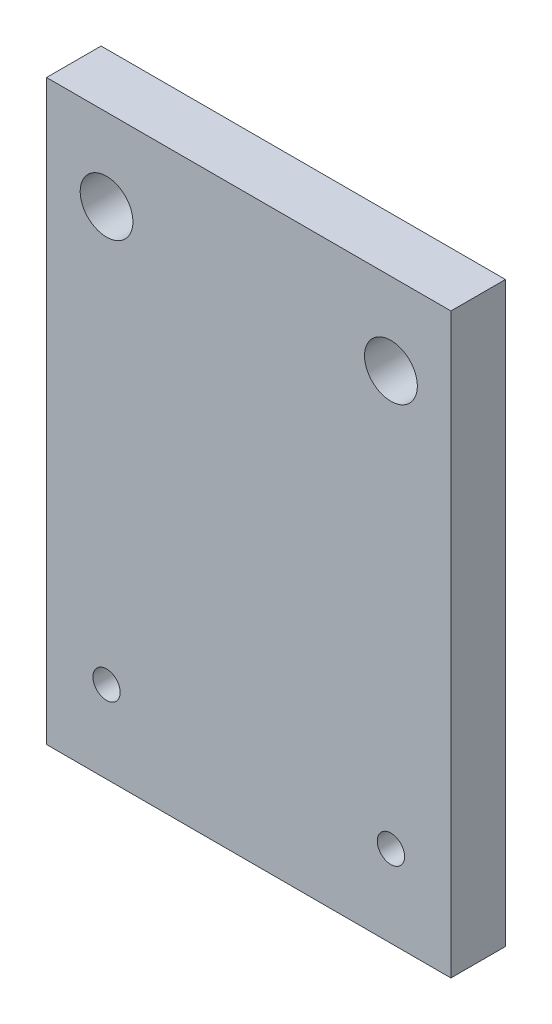
ISO-10303-21;
HEADER;
FILE_DESCRIPTION(('STEP AP214'),'2;1');
FILE_NAME('part.step','',(''),(''),'','','');
FILE_SCHEMA(('AUTOMOTIVE_DESIGN { 1 0 10303 214 1 1 1 1 }'));
ENDSEC;
DATA;
#1=APPLICATION_CONTEXT('core data for automotive mechanical design processes');
#2=APPLICATION_PROTOCOL_DEFINITION('international standard','automotive_design',2000,#1);
#3=PRODUCT_CONTEXT('',#1,'mechanical');
#4=PRODUCT('Part','Part','',(#3));
#5=PRODUCT_RELATED_PRODUCT_CATEGORY('part','',(#4));
#6=PRODUCT_DEFINITION_FORMATION('','',#4);
#7=PRODUCT_DEFINITION_CONTEXT('part definition',#1,'design');
#8=PRODUCT_DEFINITION('design','',#6,#7);
#9=PRODUCT_DEFINITION_SHAPE('','',#8);
#10=(LENGTH_UNIT() NAMED_UNIT(*) SI_UNIT(.MILLI.,.METRE.));
#11=(NAMED_UNIT(*) PLANE_ANGLE_UNIT() SI_UNIT($,.RADIAN.));
#12=(NAMED_UNIT(*) SI_UNIT($,.STERADIAN.) SOLID_ANGLE_UNIT());
#13=UNCERTAINTY_MEASURE_WITH_UNIT(LENGTH_MEASURE(1.E-05),#10,'distance_accuracy_value','');
#14=(GEOMETRIC_REPRESENTATION_CONTEXT(3) GLOBAL_UNCERTAINTY_ASSIGNED_CONTEXT((#13)) GLOBAL_UNIT_ASSIGNED_CONTEXT((#10,
#11,#12)) REPRESENTATION_CONTEXT('',''));
#15=CARTESIAN_POINT('',(0.,0.,0.));
#16=DIRECTION('',(0.,0.,1.));
#17=DIRECTION('',(1.,0.,0.));
#18=AXIS2_PLACEMENT_3D('',#15,#16,#17);
#19=CARTESIAN_POINT('',(0.,0.,5.9944));
#20=DIRECTION('',(0.,0.,1.));
#21=DIRECTION('',(1.,0.,0.));
#22=AXIS2_PLACEMENT_3D('',#19,#20,#21);
#23=PLANE('',#22);
#24=CARTESIAN_POINT('',(37.854999982,-54.499999966,5.9944));
#25=DIRECTION('',(0.,0.,1.));
#26=DIRECTION('',(1.,0.,0.));
#27=AXIS2_PLACEMENT_3D('',#24,#25,#26);
#28=CIRCLE('',#27,1.5);
#29=CARTESIAN_POINT('',(36.354999982,-54.499999966,5.9944));
#30=VERTEX_POINT('',#29);
#31=EDGE_CURVE('E146',#30,#30,#28,.T.);
#32=ORIENTED_EDGE('',*,*,#31,.F.);
#33=EDGE_LOOP('',(#32));
#34=FACE_BOUND('',#33,.T.);
#35=CARTESIAN_POINT('',(6.595000018,-9.000000034,5.9944));
#36=DIRECTION('',(0.,0.,1.));
#37=DIRECTION('',(1.,0.,0.));
#38=AXIS2_PLACEMENT_3D('',#35,#36,#37);
#39=CIRCLE('',#38,2.900000042);
#40=CARTESIAN_POINT('',(3.694999976,-9.000000034,5.9944));
#41=VERTEX_POINT('',#40);
#42=EDGE_CURVE('E116',#41,#41,#39,.T.);
#43=ORIENTED_EDGE('',*,*,#42,.F.);
#44=EDGE_LOOP('',(#43));
#45=FACE_BOUND('',#44,.T.);
#46=DIRECTION('',(0.,-1.,0.));
#47=VECTOR('',#46,1.);
#48=CARTESIAN_POINT('',(0.,0.,5.9944));
#49=LINE('',#48,#47);
#50=CARTESIAN_POINT('',(0.,0.,5.9944));
#51=VERTEX_POINT('',#50);
#52=CARTESIAN_POINT('',(0.,-63.5,5.9944));
#53=VERTEX_POINT('',#52);
#54=EDGE_CURVE('E96',#51,#53,#49,.T.);
#55=ORIENTED_EDGE('',*,*,#54,.T.);
#56=DIRECTION('',(1.,0.,0.));
#57=VECTOR('',#56,1.);
#58=CARTESIAN_POINT('',(0.,-63.5,5.9944));
#59=LINE('',#58,#57);
#60=CARTESIAN_POINT('',(44.45,-63.5,5.9944));
#61=VERTEX_POINT('',#60);
#62=EDGE_CURVE('E91',#53,#61,#59,.T.);
#63=ORIENTED_EDGE('',*,*,#62,.T.);
#64=DIRECTION('',(0.,1.,0.));
#65=VECTOR('',#64,1.);
#66=CARTESIAN_POINT('',(44.45,0.,5.9944));
#67=LINE('',#66,#65);
#68=CARTESIAN_POINT('',(44.45,0.,5.9944));
#69=VERTEX_POINT('',#68);
#70=EDGE_CURVE('E94',#61,#69,#67,.T.);
#71=ORIENTED_EDGE('',*,*,#70,.T.);
#72=DIRECTION('',(-1.,0.,0.));
#73=VECTOR('',#72,1.);
#74=CARTESIAN_POINT('',(0.,0.,5.9944));
#75=LINE('',#74,#73);
#76=EDGE_CURVE('E61',#69,#51,#75,.T.);
#77=ORIENTED_EDGE('',*,*,#76,.T.);
#78=EDGE_LOOP('',(#55,#63,#71,#77));
#79=FACE_BOUND('',#78,.T.);
#80=CARTESIAN_POINT('',(37.854999982,-9.000000034,5.9944));
#81=DIRECTION('',(0.,0.,1.));
#82=DIRECTION('',(1.,0.,0.));
#83=AXIS2_PLACEMENT_3D('',#80,#81,#82);
#84=CIRCLE('',#83,2.900000042);
#85=CARTESIAN_POINT('',(34.95499994,-9.000000034,5.9944));
#86=VERTEX_POINT('',#85);
#87=EDGE_CURVE('E138',#86,#86,#84,.T.);
#88=ORIENTED_EDGE('',*,*,#87,.F.);
#89=EDGE_LOOP('',(#88));
#90=FACE_BOUND('',#89,.T.);
#91=CARTESIAN_POINT('',(6.595000018,-54.499999966,5.9944));
#92=DIRECTION('',(0.,0.,1.));
#93=DIRECTION('',(1.,0.,0.));
#94=AXIS2_PLACEMENT_3D('',#91,#92,#93);
#95=CIRCLE('',#94,1.5);
#96=CARTESIAN_POINT('',(5.095000018,-54.499999966,5.9944));
#97=VERTEX_POINT('',#96);
#98=EDGE_CURVE('E154',#97,#97,#95,.T.);
#99=ORIENTED_EDGE('',*,*,#98,.F.);
#100=EDGE_LOOP('',(#99));
#101=FACE_BOUND('',#100,.T.);
#102=ADVANCED_FACE('F43',(#34,#45,#79,#90,#101),#23,.T.);
#103=CARTESIAN_POINT('',(0.,0.,0.));
#104=DIRECTION('',(0.,0.,1.));
#105=DIRECTION('',(1.,0.,0.));
#106=AXIS2_PLACEMENT_3D('',#103,#104,#105);
#107=PLANE('',#106);
#108=DIRECTION('',(0.,-1.,0.));
#109=VECTOR('',#108,1.);
#110=CARTESIAN_POINT('',(0.,0.,0.));
#111=LINE('',#110,#109);
#112=CARTESIAN_POINT('',(0.,0.,0.));
#113=VERTEX_POINT('',#112);
#114=CARTESIAN_POINT('',(0.,-63.5,0.));
#115=VERTEX_POINT('',#114);
#116=EDGE_CURVE('E112',#113,#115,#111,.T.);
#117=ORIENTED_EDGE('',*,*,#116,.F.);
#118=DIRECTION('',(-1.,0.,0.));
#119=VECTOR('',#118,1.);
#120=CARTESIAN_POINT('',(0.,0.,0.));
#121=LINE('',#120,#119);
#122=CARTESIAN_POINT('',(44.45,0.,0.));
#123=VERTEX_POINT('',#122);
#124=EDGE_CURVE('E84',#123,#113,#121,.T.);
#125=ORIENTED_EDGE('',*,*,#124,.F.);
#126=DIRECTION('',(0.,1.,0.));
#127=VECTOR('',#126,1.);
#128=CARTESIAN_POINT('',(44.45,0.,0.));
#129=LINE('',#128,#127);
#130=CARTESIAN_POINT('',(44.45,-63.5,0.));
#131=VERTEX_POINT('',#130);
#132=EDGE_CURVE('E78',#131,#123,#129,.T.);
#133=ORIENTED_EDGE('',*,*,#132,.F.);
#134=DIRECTION('',(1.,0.,0.));
#135=VECTOR('',#134,1.);
#136=CARTESIAN_POINT('',(0.,-63.5,0.));
#137=LINE('',#136,#135);
#138=EDGE_CURVE('E101',#115,#131,#137,.T.);
#139=ORIENTED_EDGE('',*,*,#138,.F.);
#140=EDGE_LOOP('',(#117,#125,#133,#139));
#141=FACE_BOUND('',#140,.T.);
#142=CARTESIAN_POINT('',(6.595000018,-9.000000034,0.));
#143=DIRECTION('',(0.,0.,1.));
#144=DIRECTION('',(1.,0.,0.));
#145=AXIS2_PLACEMENT_3D('',#142,#143,#144);
#146=CIRCLE('',#145,2.900000042);
#147=CARTESIAN_POINT('',(3.694999976,-9.000000034,0.));
#148=VERTEX_POINT('',#147);
#149=EDGE_CURVE('E134',#148,#148,#146,.T.);
#150=ORIENTED_EDGE('',*,*,#149,.T.);
#151=EDGE_LOOP('',(#150));
#152=FACE_BOUND('',#151,.T.);
#153=CARTESIAN_POINT('',(37.854999982,-9.000000034,0.));
#154=DIRECTION('',(0.,0.,1.));
#155=DIRECTION('',(1.,0.,0.));
#156=AXIS2_PLACEMENT_3D('',#153,#154,#155);
#157=CIRCLE('',#156,2.900000042);
#158=CARTESIAN_POINT('',(34.95499994,-9.000000034,0.));
#159=VERTEX_POINT('',#158);
#160=EDGE_CURVE('E142',#159,#159,#157,.T.);
#161=ORIENTED_EDGE('',*,*,#160,.T.);
#162=EDGE_LOOP('',(#161));
#163=FACE_BOUND('',#162,.T.);
#164=CARTESIAN_POINT('',(37.854999982,-54.499999966,0.));
#165=DIRECTION('',(0.,0.,1.));
#166=DIRECTION('',(1.,0.,0.));
#167=AXIS2_PLACEMENT_3D('',#164,#165,#166);
#168=CIRCLE('',#167,1.5);
#169=CARTESIAN_POINT('',(36.354999982,-54.499999966,0.));
#170=VERTEX_POINT('',#169);
#171=EDGE_CURVE('E150',#170,#170,#168,.T.);
#172=ORIENTED_EDGE('',*,*,#171,.T.);
#173=EDGE_LOOP('',(#172));
#174=FACE_BOUND('',#173,.T.);
#175=CARTESIAN_POINT('',(6.595000018,-54.499999966,0.));
#176=DIRECTION('',(0.,0.,1.));
#177=DIRECTION('',(1.,0.,0.));
#178=AXIS2_PLACEMENT_3D('',#175,#176,#177);
#179=CIRCLE('',#178,1.5);
#180=CARTESIAN_POINT('',(5.095000018,-54.499999966,0.));
#181=VERTEX_POINT('',#180);
#182=EDGE_CURVE('E158',#181,#181,#179,.T.);
#183=ORIENTED_EDGE('',*,*,#182,.T.);
#184=EDGE_LOOP('',(#183));
#185=FACE_BOUND('',#184,.T.);
#186=ADVANCED_FACE('F129',(#141,#152,#163,#174,#185),#107,.F.);
#187=CARTESIAN_POINT('',(0.,0.,5.9944));
#188=DIRECTION('',(1.,0.,0.));
#189=DIRECTION('',(0.,1.,0.));
#190=AXIS2_PLACEMENT_3D('',#187,#188,#189);
#191=PLANE('',#190);
#192=ORIENTED_EDGE('',*,*,#116,.T.);
#193=DIRECTION('',(0.,0.,-1.));
#194=VECTOR('',#193,1.);
#195=CARTESIAN_POINT('',(0.,-63.5,5.9944));
#196=LINE('',#195,#194);
#197=EDGE_CURVE('E11',#53,#115,#196,.T.);
#198=ORIENTED_EDGE('',*,*,#197,.F.);
#199=ORIENTED_EDGE('',*,*,#54,.F.);
#200=DIRECTION('',(0.,0.,-1.));
#201=VECTOR('',#200,1.);
#202=CARTESIAN_POINT('',(0.,0.,5.9944));
#203=LINE('',#202,#201);
#204=EDGE_CURVE('E108',#51,#113,#203,.T.);
#205=ORIENTED_EDGE('',*,*,#204,.T.);
#206=EDGE_LOOP('',(#192,#198,#199,#205));
#207=FACE_BOUND('',#206,.T.);
#208=ADVANCED_FACE('F45',(#207),#191,.F.);
#209=CARTESIAN_POINT('',(0.,-63.5,5.9944));
#210=DIRECTION('',(0.,1.,0.));
#211=DIRECTION('',(0.,0.,1.));
#212=AXIS2_PLACEMENT_3D('',#209,#210,#211);
#213=PLANE('',#212);
#214=ORIENTED_EDGE('',*,*,#138,.T.);
#215=DIRECTION('',(0.,0.,-1.));
#216=VECTOR('',#215,1.);
#217=CARTESIAN_POINT('',(44.45,-63.5,5.9944));
#218=LINE('',#217,#216);
#219=EDGE_CURVE('E53',#61,#131,#218,.T.);
#220=ORIENTED_EDGE('',*,*,#219,.F.);
#221=ORIENTED_EDGE('',*,*,#62,.F.);
#222=ORIENTED_EDGE('',*,*,#197,.T.);
#223=EDGE_LOOP('',(#214,#220,#221,#222));
#224=FACE_BOUND('',#223,.T.);
#225=ADVANCED_FACE('F100',(#224),#213,.F.);
#226=CARTESIAN_POINT('',(44.45,0.,5.9944));
#227=DIRECTION('',(-1.,0.,0.));
#228=DIRECTION('',(0.,-1.,0.));
#229=AXIS2_PLACEMENT_3D('',#226,#227,#228);
#230=PLANE('',#229);
#231=ORIENTED_EDGE('',*,*,#132,.T.);
#232=DIRECTION('',(0.,0.,-1.));
#233=VECTOR('',#232,1.);
#234=CARTESIAN_POINT('',(44.45,0.,5.9944));
#235=LINE('',#234,#233);
#236=EDGE_CURVE('E103',#69,#123,#235,.T.);
#237=ORIENTED_EDGE('',*,*,#236,.F.);
#238=ORIENTED_EDGE('',*,*,#70,.F.);
#239=ORIENTED_EDGE('',*,*,#219,.T.);
#240=EDGE_LOOP('',(#231,#237,#238,#239));
#241=FACE_BOUND('',#240,.T.);
#242=ADVANCED_FACE('F104',(#241),#230,.F.);
#243=CARTESIAN_POINT('',(0.,0.,5.9944));
#244=DIRECTION('',(0.,-1.,0.));
#245=DIRECTION('',(0.,0.,-1.));
#246=AXIS2_PLACEMENT_3D('',#243,#244,#245);
#247=PLANE('',#246);
#248=ORIENTED_EDGE('',*,*,#124,.T.);
#249=ORIENTED_EDGE('',*,*,#204,.F.);
#250=ORIENTED_EDGE('',*,*,#76,.F.);
#251=ORIENTED_EDGE('',*,*,#236,.T.);
#252=EDGE_LOOP('',(#248,#249,#250,#251));
#253=FACE_BOUND('',#252,.T.);
#254=ADVANCED_FACE('F126',(#253),#247,.F.);
#255=CARTESIAN_POINT('',(6.595000018,-9.000000034,5.9944));
#256=DIRECTION('',(0.,0.,-1.));
#257=DIRECTION('',(-1.,0.,0.));
#258=AXIS2_PLACEMENT_3D('',#255,#256,#257);
#259=CYLINDRICAL_SURFACE('',#258,2.900000042);
#260=CARTESIAN_POINT('',(3.694999976,-9.000000034,5.9944));
#261=CARTESIAN_POINT('',(3.694999976,-9.000000034,5.93195833333333));
#262=CARTESIAN_POINT('',(3.694999976,-9.000000034,5.86951666666667));
#263=CARTESIAN_POINT('',(3.694999976,-9.000000034,5.74463333333333));
#264=CARTESIAN_POINT('',(3.694999976,-9.000000034,5.68219166666667));
#265=CARTESIAN_POINT('',(3.694999976,-9.000000034,5.55730833333333));
#266=CARTESIAN_POINT('',(3.694999976,-9.000000034,5.49486666666667));
#267=CARTESIAN_POINT('',(3.694999976,-9.000000034,5.36998333333333));
#268=CARTESIAN_POINT('',(3.694999976,-9.000000034,5.30754166666667));
#269=CARTESIAN_POINT('',(3.694999976,-9.000000034,5.18265833333333));
#270=CARTESIAN_POINT('',(3.694999976,-9.000000034,5.12021666666667));
#271=CARTESIAN_POINT('',(3.694999976,-9.000000034,4.99533333333333));
#272=CARTESIAN_POINT('',(3.694999976,-9.000000034,4.93289166666667));
#273=CARTESIAN_POINT('',(3.694999976,-9.000000034,4.80800833333333));
#274=CARTESIAN_POINT('',(3.694999976,-9.000000034,4.74556666666667));
#275=CARTESIAN_POINT('',(3.694999976,-9.000000034,4.62068333333333));
#276=CARTESIAN_POINT('',(3.694999976,-9.000000034,4.55824166666667));
#277=CARTESIAN_POINT('',(3.694999976,-9.000000034,4.43335833333333));
#278=CARTESIAN_POINT('',(3.694999976,-9.000000034,4.37091666666667));
#279=CARTESIAN_POINT('',(3.694999976,-9.000000034,4.24603333333333));
#280=CARTESIAN_POINT('',(3.694999976,-9.000000034,4.18359166666667));
#281=CARTESIAN_POINT('',(3.694999976,-9.000000034,4.05870833333333));
#282=CARTESIAN_POINT('',(3.694999976,-9.000000034,3.99626666666667));
#283=CARTESIAN_POINT('',(3.694999976,-9.000000034,3.87138333333333));
#284=CARTESIAN_POINT('',(3.694999976,-9.000000034,3.80894166666667));
#285=CARTESIAN_POINT('',(3.694999976,-9.000000034,3.68405833333333));
#286=CARTESIAN_POINT('',(3.694999976,-9.000000034,3.62161666666667));
#287=CARTESIAN_POINT('',(3.694999976,-9.000000034,3.49673333333333));
#288=CARTESIAN_POINT('',(3.694999976,-9.000000034,3.43429166666667));
#289=CARTESIAN_POINT('',(3.694999976,-9.000000034,3.30940833333333));
#290=CARTESIAN_POINT('',(3.694999976,-9.000000034,3.24696666666667));
#291=CARTESIAN_POINT('',(3.694999976,-9.000000034,3.12208333333333));
#292=CARTESIAN_POINT('',(3.694999976,-9.000000034,3.05964166666667));
#293=CARTESIAN_POINT('',(3.694999976,-9.000000034,2.93475833333333));
#294=CARTESIAN_POINT('',(3.694999976,-9.000000034,2.87231666666667));
#295=CARTESIAN_POINT('',(3.694999976,-9.000000034,2.74743333333333));
#296=CARTESIAN_POINT('',(3.694999976,-9.000000034,2.68499166666667));
#297=CARTESIAN_POINT('',(3.694999976,-9.000000034,2.56010833333333));
#298=CARTESIAN_POINT('',(3.694999976,-9.000000034,2.49766666666667));
#299=CARTESIAN_POINT('',(3.694999976,-9.000000034,2.37278333333333));
#300=CARTESIAN_POINT('',(3.694999976,-9.000000034,2.31034166666667));
#301=CARTESIAN_POINT('',(3.694999976,-9.000000034,2.18545833333333));
#302=CARTESIAN_POINT('',(3.694999976,-9.000000034,2.12301666666667));
#303=CARTESIAN_POINT('',(3.694999976,-9.000000034,1.99813333333333));
#304=CARTESIAN_POINT('',(3.694999976,-9.000000034,1.93569166666667));
#305=CARTESIAN_POINT('',(3.694999976,-9.000000034,1.81080833333333));
#306=CARTESIAN_POINT('',(3.694999976,-9.000000034,1.74836666666667));
#307=CARTESIAN_POINT('',(3.694999976,-9.000000034,1.62348333333333));
#308=CARTESIAN_POINT('',(3.694999976,-9.000000034,1.56104166666667));
#309=CARTESIAN_POINT('',(3.694999976,-9.000000034,1.43615833333333));
#310=CARTESIAN_POINT('',(3.694999976,-9.000000034,1.37371666666667));
#311=CARTESIAN_POINT('',(3.694999976,-9.000000034,1.24883333333333));
#312=CARTESIAN_POINT('',(3.694999976,-9.000000034,1.18639166666667));
#313=CARTESIAN_POINT('',(3.694999976,-9.000000034,1.06150833333333));
#314=CARTESIAN_POINT('',(3.694999976,-9.000000034,0.999066666666667));
#315=CARTESIAN_POINT('',(3.694999976,-9.000000034,0.874183333333333));
#316=CARTESIAN_POINT('',(3.694999976,-9.000000034,0.811741666666666));
#317=CARTESIAN_POINT('',(3.694999976,-9.000000034,0.686858333333333));
#318=CARTESIAN_POINT('',(3.694999976,-9.000000034,0.624416666666667));
#319=CARTESIAN_POINT('',(3.694999976,-9.000000034,0.499533333333333));
#320=CARTESIAN_POINT('',(3.694999976,-9.000000034,0.437091666666667));
#321=CARTESIAN_POINT('',(3.694999976,-9.000000034,0.312208333333333));
#322=CARTESIAN_POINT('',(3.694999976,-9.000000034,0.249766666666667));
#323=CARTESIAN_POINT('',(3.694999976,-9.000000034,0.124883333333334));
#324=CARTESIAN_POINT('',(3.694999976,-9.000000034,0.0624416666666667));
#325=CARTESIAN_POINT('',(3.694999976,-9.000000034,0.));
#326=B_SPLINE_CURVE_WITH_KNOTS('',3,(#260,#261,#262,#263,#264,#265,#266,#267,#268,#269,#270,
#271,#272,#273,#274,#275,#276,#277,#278,#279,#280,#281,#282,#283,#284,#285,#286,#287,#288,#289,
#290,#291,#292,#293,#294,#295,#296,#297,#298,#299,#300,#301,#302,#303,#304,#305,#306,#307,#308,
#309,#310,#311,#312,#313,#314,#315,#316,#317,#318,#319,#320,#321,#322,#323,#324,#325),
.UNSPECIFIED.,.F.,.F.,(4,2,2,2,2,2,2,2,2,2,2,2,2,2,2,2,2,2,2,2,2,2,2,2,2,2,2,2,2,2,2,2,4),(0.,
0.187324999999999,0.37465,0.561974999999999,0.7493,0.936624999999999,1.12395,1.311275,1.4986,
1.685925,1.87325,2.060575,2.2479,2.435225,2.62255,2.809875,2.9972,3.184525,3.37185,3.559175,
3.7465,3.933825,4.12115,4.308475,4.4958,4.683125,4.87045,5.057775,5.2451,5.432425,5.61975,
5.807075,5.9944),.UNSPECIFIED.);
#327=EDGE_CURVE('BSEAM179',#41,#148,#326,.T.);
#328=ORIENTED_EDGE('',*,*,#42,.T.);
#329=ORIENTED_EDGE('',*,*,#149,.F.);
#330=ORIENTED_EDGE('',*,*,#327,.T.);
#331=ORIENTED_EDGE('',*,*,#327,.F.);
#332=EDGE_LOOP('',(#328,#330,#329,#331));
#333=FACE_BOUND('',#332,.T.);
#334=ADVANCED_FACE('F179',(#333),#259,.F.);
#335=CARTESIAN_POINT('',(37.854999982,-9.000000034,5.9944));
#336=DIRECTION('',(0.,0.,-1.));
#337=DIRECTION('',(-1.,0.,0.));
#338=AXIS2_PLACEMENT_3D('',#335,#336,#337);
#339=CYLINDRICAL_SURFACE('',#338,2.900000042);
#340=CARTESIAN_POINT('',(34.95499994,-9.000000034,5.9944));
#341=CARTESIAN_POINT('',(34.95499994,-9.000000034,5.93195833333333));
#342=CARTESIAN_POINT('',(34.95499994,-9.000000034,5.86951666666667));
#343=CARTESIAN_POINT('',(34.95499994,-9.000000034,5.74463333333333));
#344=CARTESIAN_POINT('',(34.95499994,-9.000000034,5.68219166666667));
#345=CARTESIAN_POINT('',(34.95499994,-9.000000034,5.55730833333333));
#346=CARTESIAN_POINT('',(34.95499994,-9.000000034,5.49486666666667));
#347=CARTESIAN_POINT('',(34.95499994,-9.000000034,5.36998333333333));
#348=CARTESIAN_POINT('',(34.95499994,-9.000000034,5.30754166666667));
#349=CARTESIAN_POINT('',(34.95499994,-9.000000034,5.18265833333333));
#350=CARTESIAN_POINT('',(34.95499994,-9.000000034,5.12021666666667));
#351=CARTESIAN_POINT('',(34.95499994,-9.000000034,4.99533333333333));
#352=CARTESIAN_POINT('',(34.95499994,-9.000000034,4.93289166666667));
#353=CARTESIAN_POINT('',(34.95499994,-9.000000034,4.80800833333333));
#354=CARTESIAN_POINT('',(34.95499994,-9.000000034,4.74556666666667));
#355=CARTESIAN_POINT('',(34.95499994,-9.000000034,4.62068333333333));
#356=CARTESIAN_POINT('',(34.95499994,-9.000000034,4.55824166666667));
#357=CARTESIAN_POINT('',(34.95499994,-9.000000034,4.43335833333333));
#358=CARTESIAN_POINT('',(34.95499994,-9.000000034,4.37091666666667));
#359=CARTESIAN_POINT('',(34.95499994,-9.000000034,4.24603333333333));
#360=CARTESIAN_POINT('',(34.95499994,-9.000000034,4.18359166666667));
#361=CARTESIAN_POINT('',(34.95499994,-9.000000034,4.05870833333333));
#362=CARTESIAN_POINT('',(34.95499994,-9.000000034,3.99626666666667));
#363=CARTESIAN_POINT('',(34.95499994,-9.000000034,3.87138333333333));
#364=CARTESIAN_POINT('',(34.95499994,-9.000000034,3.80894166666667));
#365=CARTESIAN_POINT('',(34.95499994,-9.000000034,3.68405833333333));
#366=CARTESIAN_POINT('',(34.95499994,-9.000000034,3.62161666666667));
#367=CARTESIAN_POINT('',(34.95499994,-9.000000034,3.49673333333333));
#368=CARTESIAN_POINT('',(34.95499994,-9.000000034,3.43429166666667));
#369=CARTESIAN_POINT('',(34.95499994,-9.000000034,3.30940833333333));
#370=CARTESIAN_POINT('',(34.95499994,-9.000000034,3.24696666666667));
#371=CARTESIAN_POINT('',(34.95499994,-9.000000034,3.12208333333333));
#372=CARTESIAN_POINT('',(34.95499994,-9.000000034,3.05964166666667));
#373=CARTESIAN_POINT('',(34.95499994,-9.000000034,2.93475833333333));
#374=CARTESIAN_POINT('',(34.95499994,-9.000000034,2.87231666666667));
#375=CARTESIAN_POINT('',(34.95499994,-9.000000034,2.74743333333333));
#376=CARTESIAN_POINT('',(34.95499994,-9.000000034,2.68499166666667));
#377=CARTESIAN_POINT('',(34.95499994,-9.000000034,2.56010833333333));
#378=CARTESIAN_POINT('',(34.95499994,-9.000000034,2.49766666666667));
#379=CARTESIAN_POINT('',(34.95499994,-9.000000034,2.37278333333333));
#380=CARTESIAN_POINT('',(34.95499994,-9.000000034,2.31034166666667));
#381=CARTESIAN_POINT('',(34.95499994,-9.000000034,2.18545833333333));
#382=CARTESIAN_POINT('',(34.95499994,-9.000000034,2.12301666666667));
#383=CARTESIAN_POINT('',(34.95499994,-9.000000034,1.99813333333333));
#384=CARTESIAN_POINT('',(34.95499994,-9.000000034,1.93569166666667));
#385=CARTESIAN_POINT('',(34.95499994,-9.000000034,1.81080833333333));
#386=CARTESIAN_POINT('',(34.95499994,-9.000000034,1.74836666666667));
#387=CARTESIAN_POINT('',(34.95499994,-9.000000034,1.62348333333333));
#388=CARTESIAN_POINT('',(34.95499994,-9.000000034,1.56104166666667));
#389=CARTESIAN_POINT('',(34.95499994,-9.000000034,1.43615833333333));
#390=CARTESIAN_POINT('',(34.95499994,-9.000000034,1.37371666666667));
#391=CARTESIAN_POINT('',(34.95499994,-9.000000034,1.24883333333333));
#392=CARTESIAN_POINT('',(34.95499994,-9.000000034,1.18639166666667));
#393=CARTESIAN_POINT('',(34.95499994,-9.000000034,1.06150833333333));
#394=CARTESIAN_POINT('',(34.95499994,-9.000000034,0.999066666666667));
#395=CARTESIAN_POINT('',(34.95499994,-9.000000034,0.874183333333333));
#396=CARTESIAN_POINT('',(34.95499994,-9.000000034,0.811741666666666));
#397=CARTESIAN_POINT('',(34.95499994,-9.000000034,0.686858333333333));
#398=CARTESIAN_POINT('',(34.95499994,-9.000000034,0.624416666666667));
#399=CARTESIAN_POINT('',(34.95499994,-9.000000034,0.499533333333333));
#400=CARTESIAN_POINT('',(34.95499994,-9.000000034,0.437091666666667));
#401=CARTESIAN_POINT('',(34.95499994,-9.000000034,0.312208333333333));
#402=CARTESIAN_POINT('',(34.95499994,-9.000000034,0.249766666666667));
#403=CARTESIAN_POINT('',(34.95499994,-9.000000034,0.124883333333334));
#404=CARTESIAN_POINT('',(34.95499994,-9.000000034,0.0624416666666667));
#405=CARTESIAN_POINT('',(34.95499994,-9.000000034,0.));
#406=B_SPLINE_CURVE_WITH_KNOTS('',3,(#340,#341,#342,#343,#344,#345,#346,#347,#348,#349,#350,
#351,#352,#353,#354,#355,#356,#357,#358,#359,#360,#361,#362,#363,#364,#365,#366,#367,#368,#369,
#370,#371,#372,#373,#374,#375,#376,#377,#378,#379,#380,#381,#382,#383,#384,#385,#386,#387,#388,
#389,#390,#391,#392,#393,#394,#395,#396,#397,#398,#399,#400,#401,#402,#403,#404,#405),
.UNSPECIFIED.,.F.,.F.,(4,2,2,2,2,2,2,2,2,2,2,2,2,2,2,2,2,2,2,2,2,2,2,2,2,2,2,2,2,2,2,2,4),(0.,
0.187324999999999,0.37465,0.561974999999999,0.7493,0.936624999999999,1.12395,1.311275,1.4986,
1.685925,1.87325,2.060575,2.2479,2.435225,2.62255,2.809875,2.9972,3.184525,3.37185,3.559175,
3.7465,3.933825,4.12115,4.308475,4.4958,4.683125,4.87045,5.057775,5.2451,5.432425,5.61975,
5.807075,5.9944),.UNSPECIFIED.);
#407=EDGE_CURVE('BSEAM233',#86,#159,#406,.T.);
#408=ORIENTED_EDGE('',*,*,#87,.T.);
#409=ORIENTED_EDGE('',*,*,#160,.F.);
#410=ORIENTED_EDGE('',*,*,#407,.T.);
#411=ORIENTED_EDGE('',*,*,#407,.F.);
#412=EDGE_LOOP('',(#408,#410,#409,#411));
#413=FACE_BOUND('',#412,.T.);
#414=ADVANCED_FACE('F233',(#413),#339,.F.);
#415=CARTESIAN_POINT('',(37.854999982,-54.499999966,5.9944));
#416=DIRECTION('',(0.,0.,-1.));
#417=DIRECTION('',(-1.,0.,0.));
#418=AXIS2_PLACEMENT_3D('',#415,#416,#417);
#419=CYLINDRICAL_SURFACE('',#418,1.5);
#420=CARTESIAN_POINT('',(36.354999982,-54.499999966,5.9944));
#421=CARTESIAN_POINT('',(36.354999982,-54.499999966,5.93195833333333));
#422=CARTESIAN_POINT('',(36.354999982,-54.499999966,5.86951666666667));
#423=CARTESIAN_POINT('',(36.354999982,-54.499999966,5.74463333333333));
#424=CARTESIAN_POINT('',(36.354999982,-54.499999966,5.68219166666667));
#425=CARTESIAN_POINT('',(36.354999982,-54.499999966,5.55730833333333));
#426=CARTESIAN_POINT('',(36.354999982,-54.499999966,5.49486666666667));
#427=CARTESIAN_POINT('',(36.354999982,-54.499999966,5.36998333333333));
#428=CARTESIAN_POINT('',(36.354999982,-54.499999966,5.30754166666667));
#429=CARTESIAN_POINT('',(36.354999982,-54.499999966,5.18265833333333));
#430=CARTESIAN_POINT('',(36.354999982,-54.499999966,5.12021666666667));
#431=CARTESIAN_POINT('',(36.354999982,-54.499999966,4.99533333333333));
#432=CARTESIAN_POINT('',(36.354999982,-54.499999966,4.93289166666667));
#433=CARTESIAN_POINT('',(36.354999982,-54.499999966,4.80800833333333));
#434=CARTESIAN_POINT('',(36.354999982,-54.499999966,4.74556666666667));
#435=CARTESIAN_POINT('',(36.354999982,-54.499999966,4.62068333333333));
#436=CARTESIAN_POINT('',(36.354999982,-54.499999966,4.55824166666667));
#437=CARTESIAN_POINT('',(36.354999982,-54.499999966,4.43335833333333));
#438=CARTESIAN_POINT('',(36.354999982,-54.499999966,4.37091666666667));
#439=CARTESIAN_POINT('',(36.354999982,-54.499999966,4.24603333333333));
#440=CARTESIAN_POINT('',(36.354999982,-54.499999966,4.18359166666667));
#441=CARTESIAN_POINT('',(36.354999982,-54.499999966,4.05870833333333));
#442=CARTESIAN_POINT('',(36.354999982,-54.499999966,3.99626666666667));
#443=CARTESIAN_POINT('',(36.354999982,-54.499999966,3.87138333333333));
#444=CARTESIAN_POINT('',(36.354999982,-54.499999966,3.80894166666667));
#445=CARTESIAN_POINT('',(36.354999982,-54.499999966,3.68405833333333));
#446=CARTESIAN_POINT('',(36.354999982,-54.499999966,3.62161666666667));
#447=CARTESIAN_POINT('',(36.354999982,-54.499999966,3.49673333333333));
#448=CARTESIAN_POINT('',(36.354999982,-54.499999966,3.43429166666667));
#449=CARTESIAN_POINT('',(36.354999982,-54.499999966,3.30940833333333));
#450=CARTESIAN_POINT('',(36.354999982,-54.499999966,3.24696666666667));
#451=CARTESIAN_POINT('',(36.354999982,-54.499999966,3.12208333333333));
#452=CARTESIAN_POINT('',(36.354999982,-54.499999966,3.05964166666667));
#453=CARTESIAN_POINT('',(36.354999982,-54.499999966,2.93475833333333));
#454=CARTESIAN_POINT('',(36.354999982,-54.499999966,2.87231666666667));
#455=CARTESIAN_POINT('',(36.354999982,-54.499999966,2.74743333333333));
#456=CARTESIAN_POINT('',(36.354999982,-54.499999966,2.68499166666667));
#457=CARTESIAN_POINT('',(36.354999982,-54.499999966,2.56010833333333));
#458=CARTESIAN_POINT('',(36.354999982,-54.499999966,2.49766666666667));
#459=CARTESIAN_POINT('',(36.354999982,-54.499999966,2.37278333333333));
#460=CARTESIAN_POINT('',(36.354999982,-54.499999966,2.31034166666667));
#461=CARTESIAN_POINT('',(36.354999982,-54.499999966,2.18545833333333));
#462=CARTESIAN_POINT('',(36.354999982,-54.499999966,2.12301666666667));
#463=CARTESIAN_POINT('',(36.354999982,-54.499999966,1.99813333333333));
#464=CARTESIAN_POINT('',(36.354999982,-54.499999966,1.93569166666667));
#465=CARTESIAN_POINT('',(36.354999982,-54.499999966,1.81080833333333));
#466=CARTESIAN_POINT('',(36.354999982,-54.499999966,1.74836666666667));
#467=CARTESIAN_POINT('',(36.354999982,-54.499999966,1.62348333333333));
#468=CARTESIAN_POINT('',(36.354999982,-54.499999966,1.56104166666667));
#469=CARTESIAN_POINT('',(36.354999982,-54.499999966,1.43615833333333));
#470=CARTESIAN_POINT('',(36.354999982,-54.499999966,1.37371666666667));
#471=CARTESIAN_POINT('',(36.354999982,-54.499999966,1.24883333333333));
#472=CARTESIAN_POINT('',(36.354999982,-54.499999966,1.18639166666667));
#473=CARTESIAN_POINT('',(36.354999982,-54.499999966,1.06150833333333));
#474=CARTESIAN_POINT('',(36.354999982,-54.499999966,0.999066666666667));
#475=CARTESIAN_POINT('',(36.354999982,-54.499999966,0.874183333333333));
#476=CARTESIAN_POINT('',(36.354999982,-54.499999966,0.811741666666666));
#477=CARTESIAN_POINT('',(36.354999982,-54.499999966,0.686858333333333));
#478=CARTESIAN_POINT('',(36.354999982,-54.499999966,0.624416666666667));
#479=CARTESIAN_POINT('',(36.354999982,-54.499999966,0.499533333333333));
#480=CARTESIAN_POINT('',(36.354999982,-54.499999966,0.437091666666667));
#481=CARTESIAN_POINT('',(36.354999982,-54.499999966,0.312208333333333));
#482=CARTESIAN_POINT('',(36.354999982,-54.499999966,0.249766666666667));
#483=CARTESIAN_POINT('',(36.354999982,-54.499999966,0.124883333333334));
#484=CARTESIAN_POINT('',(36.354999982,-54.499999966,0.0624416666666667));
#485=CARTESIAN_POINT('',(36.354999982,-54.499999966,0.));
#486=B_SPLINE_CURVE_WITH_KNOTS('',3,(#420,#421,#422,#423,#424,#425,#426,#427,#428,#429,#430,
#431,#432,#433,#434,#435,#436,#437,#438,#439,#440,#441,#442,#443,#444,#445,#446,#447,#448,#449,
#450,#451,#452,#453,#454,#455,#456,#457,#458,#459,#460,#461,#462,#463,#464,#465,#466,#467,#468,
#469,#470,#471,#472,#473,#474,#475,#476,#477,#478,#479,#480,#481,#482,#483,#484,#485),
.UNSPECIFIED.,.F.,.F.,(4,2,2,2,2,2,2,2,2,2,2,2,2,2,2,2,2,2,2,2,2,2,2,2,2,2,2,2,2,2,2,2,4),(0.,
0.187325,0.374650000000001,0.561975,0.749300000000001,0.936625000000001,1.12395,1.311275,1.4986,
1.685925,1.87325,2.060575,2.2479,2.435225,2.62255,2.809875,2.9972,3.184525,3.37185,3.559175,
3.7465,3.933825,4.12115,4.308475,4.4958,4.683125,4.87045,5.057775,5.2451,5.432425,5.61975,
5.807075,5.9944),.UNSPECIFIED.);
#487=EDGE_CURVE('BSEAM242',#30,#170,#486,.T.);
#488=ORIENTED_EDGE('',*,*,#31,.T.);
#489=ORIENTED_EDGE('',*,*,#171,.F.);
#490=ORIENTED_EDGE('',*,*,#487,.T.);
#491=ORIENTED_EDGE('',*,*,#487,.F.);
#492=EDGE_LOOP('',(#488,#490,#489,#491));
#493=FACE_BOUND('',#492,.T.);
#494=ADVANCED_FACE('F242',(#493),#419,.F.);
#495=CARTESIAN_POINT('',(6.595000018,-54.499999966,5.9944));
#496=DIRECTION('',(0.,0.,-1.));
#497=DIRECTION('',(-1.,0.,0.));
#498=AXIS2_PLACEMENT_3D('',#495,#496,#497);
#499=CYLINDRICAL_SURFACE('',#498,1.5);
#500=CARTESIAN_POINT('',(5.095000018,-54.499999966,5.9944));
#501=CARTESIAN_POINT('',(5.095000018,-54.499999966,5.93195833333333));
#502=CARTESIAN_POINT('',(5.095000018,-54.499999966,5.86951666666667));
#503=CARTESIAN_POINT('',(5.095000018,-54.499999966,5.74463333333333));
#504=CARTESIAN_POINT('',(5.095000018,-54.499999966,5.68219166666667));
#505=CARTESIAN_POINT('',(5.095000018,-54.499999966,5.55730833333333));
#506=CARTESIAN_POINT('',(5.095000018,-54.499999966,5.49486666666667));
#507=CARTESIAN_POINT('',(5.095000018,-54.499999966,5.36998333333333));
#508=CARTESIAN_POINT('',(5.095000018,-54.499999966,5.30754166666667));
#509=CARTESIAN_POINT('',(5.095000018,-54.499999966,5.18265833333333));
#510=CARTESIAN_POINT('',(5.095000018,-54.499999966,5.12021666666667));
#511=CARTESIAN_POINT('',(5.095000018,-54.499999966,4.99533333333333));
#512=CARTESIAN_POINT('',(5.095000018,-54.499999966,4.93289166666667));
#513=CARTESIAN_POINT('',(5.095000018,-54.499999966,4.80800833333333));
#514=CARTESIAN_POINT('',(5.095000018,-54.499999966,4.74556666666667));
#515=CARTESIAN_POINT('',(5.095000018,-54.499999966,4.62068333333333));
#516=CARTESIAN_POINT('',(5.095000018,-54.499999966,4.55824166666667));
#517=CARTESIAN_POINT('',(5.095000018,-54.499999966,4.43335833333333));
#518=CARTESIAN_POINT('',(5.095000018,-54.499999966,4.37091666666667));
#519=CARTESIAN_POINT('',(5.095000018,-54.499999966,4.24603333333333));
#520=CARTESIAN_POINT('',(5.095000018,-54.499999966,4.18359166666667));
#521=CARTESIAN_POINT('',(5.095000018,-54.499999966,4.05870833333333));
#522=CARTESIAN_POINT('',(5.095000018,-54.499999966,3.99626666666667));
#523=CARTESIAN_POINT('',(5.095000018,-54.499999966,3.87138333333333));
#524=CARTESIAN_POINT('',(5.095000018,-54.499999966,3.80894166666667));
#525=CARTESIAN_POINT('',(5.095000018,-54.499999966,3.68405833333333));
#526=CARTESIAN_POINT('',(5.095000018,-54.499999966,3.62161666666667));
#527=CARTESIAN_POINT('',(5.095000018,-54.499999966,3.49673333333333));
#528=CARTESIAN_POINT('',(5.095000018,-54.499999966,3.43429166666667));
#529=CARTESIAN_POINT('',(5.095000018,-54.499999966,3.30940833333333));
#530=CARTESIAN_POINT('',(5.095000018,-54.499999966,3.24696666666667));
#531=CARTESIAN_POINT('',(5.095000018,-54.499999966,3.12208333333333));
#532=CARTESIAN_POINT('',(5.095000018,-54.499999966,3.05964166666667));
#533=CARTESIAN_POINT('',(5.095000018,-54.499999966,2.93475833333333));
#534=CARTESIAN_POINT('',(5.095000018,-54.499999966,2.87231666666667));
#535=CARTESIAN_POINT('',(5.095000018,-54.499999966,2.74743333333333));
#536=CARTESIAN_POINT('',(5.095000018,-54.499999966,2.68499166666667));
#537=CARTESIAN_POINT('',(5.095000018,-54.499999966,2.56010833333333));
#538=CARTESIAN_POINT('',(5.095000018,-54.499999966,2.49766666666667));
#539=CARTESIAN_POINT('',(5.095000018,-54.499999966,2.37278333333333));
#540=CARTESIAN_POINT('',(5.095000018,-54.499999966,2.31034166666667));
#541=CARTESIAN_POINT('',(5.095000018,-54.499999966,2.18545833333333));
#542=CARTESIAN_POINT('',(5.095000018,-54.499999966,2.12301666666667));
#543=CARTESIAN_POINT('',(5.095000018,-54.499999966,1.99813333333333));
#544=CARTESIAN_POINT('',(5.095000018,-54.499999966,1.93569166666667));
#545=CARTESIAN_POINT('',(5.095000018,-54.499999966,1.81080833333333));
#546=CARTESIAN_POINT('',(5.095000018,-54.499999966,1.74836666666667));
#547=CARTESIAN_POINT('',(5.095000018,-54.499999966,1.62348333333333));
#548=CARTESIAN_POINT('',(5.095000018,-54.499999966,1.56104166666667));
#549=CARTESIAN_POINT('',(5.095000018,-54.499999966,1.43615833333333));
#550=CARTESIAN_POINT('',(5.095000018,-54.499999966,1.37371666666667));
#551=CARTESIAN_POINT('',(5.095000018,-54.499999966,1.24883333333333));
#552=CARTESIAN_POINT('',(5.095000018,-54.499999966,1.18639166666667));
#553=CARTESIAN_POINT('',(5.095000018,-54.499999966,1.06150833333333));
#554=CARTESIAN_POINT('',(5.095000018,-54.499999966,0.999066666666667));
#555=CARTESIAN_POINT('',(5.095000018,-54.499999966,0.874183333333333));
#556=CARTESIAN_POINT('',(5.095000018,-54.499999966,0.811741666666666));
#557=CARTESIAN_POINT('',(5.095000018,-54.499999966,0.686858333333333));
#558=CARTESIAN_POINT('',(5.095000018,-54.499999966,0.624416666666667));
#559=CARTESIAN_POINT('',(5.095000018,-54.499999966,0.499533333333333));
#560=CARTESIAN_POINT('',(5.095000018,-54.499999966,0.437091666666667));
#561=CARTESIAN_POINT('',(5.095000018,-54.499999966,0.312208333333333));
#562=CARTESIAN_POINT('',(5.095000018,-54.499999966,0.249766666666667));
#563=CARTESIAN_POINT('',(5.095000018,-54.499999966,0.124883333333334));
#564=CARTESIAN_POINT('',(5.095000018,-54.499999966,0.0624416666666667));
#565=CARTESIAN_POINT('',(5.095000018,-54.499999966,0.));
#566=B_SPLINE_CURVE_WITH_KNOTS('',3,(#500,#501,#502,#503,#504,#505,#506,#507,#508,#509,#510,
#511,#512,#513,#514,#515,#516,#517,#518,#519,#520,#521,#522,#523,#524,#525,#526,#527,#528,#529,
#530,#531,#532,#533,#534,#535,#536,#537,#538,#539,#540,#541,#542,#543,#544,#545,#546,#547,#548,
#549,#550,#551,#552,#553,#554,#555,#556,#557,#558,#559,#560,#561,#562,#563,#564,#565),
.UNSPECIFIED.,.F.,.F.,(4,2,2,2,2,2,2,2,2,2,2,2,2,2,2,2,2,2,2,2,2,2,2,2,2,2,2,2,2,2,2,2,4),(0.,
0.187325,0.374650000000001,0.561975,0.749300000000001,0.936625000000001,1.12395,1.311275,1.4986,
1.685925,1.87325,2.060575,2.2479,2.435225,2.62255,2.809875,2.9972,3.184525,3.37185,3.559175,
3.7465,3.933825,4.12115,4.308475,4.4958,4.683125,4.87045,5.057775,5.2451,5.432425,5.61975,
5.807075,5.9944),.UNSPECIFIED.);
#567=EDGE_CURVE('BSEAM166',#97,#181,#566,.T.);
#568=ORIENTED_EDGE('',*,*,#98,.T.);
#569=ORIENTED_EDGE('',*,*,#182,.F.);
#570=ORIENTED_EDGE('',*,*,#567,.T.);
#571=ORIENTED_EDGE('',*,*,#567,.F.);
#572=EDGE_LOOP('',(#568,#570,#569,#571));
#573=FACE_BOUND('',#572,.T.);
#574=ADVANCED_FACE('F166',(#573),#499,.F.);
#575=CLOSED_SHELL('',(#102,#186,#208,#225,#242,#254,#334,#414,#494,#574));
#576=MANIFOLD_SOLID_BREP('B2',#575);
#577=ADVANCED_BREP_SHAPE_REPRESENTATION('',(#18,#576),#14);
#578=SHAPE_DEFINITION_REPRESENTATION(#9,#577);
ENDSEC;
END-ISO-10303-21;
